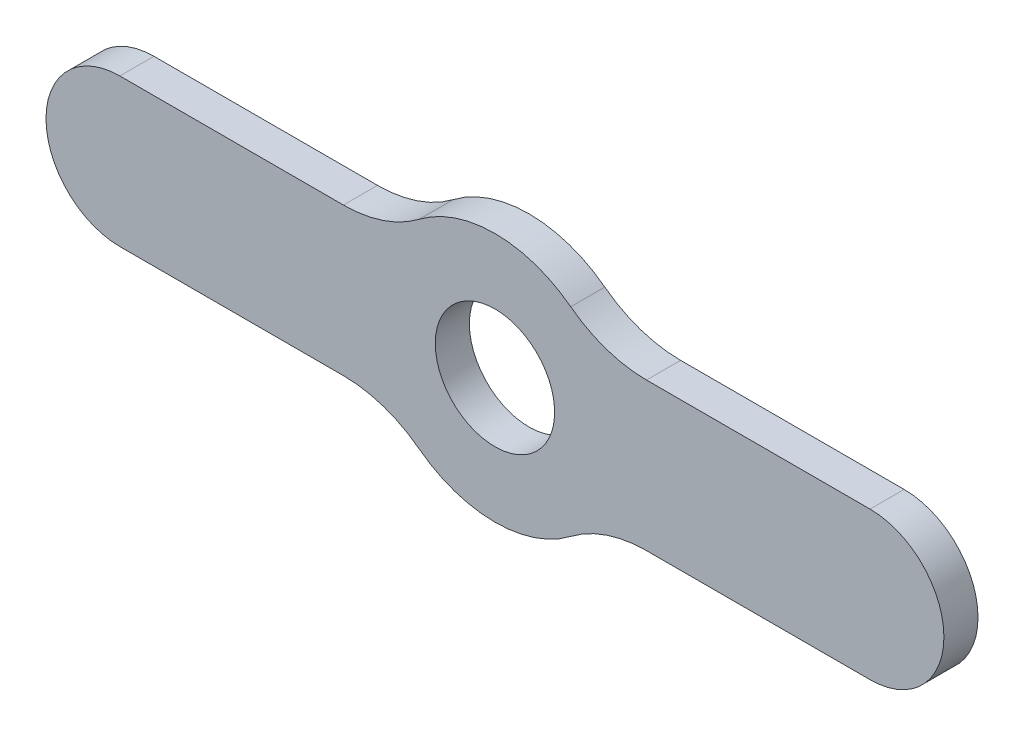
ISO-10303-21;
HEADER;
FILE_DESCRIPTION(('STEP AP214'),'2;1');
FILE_NAME('part.step','',(''),(''),'','','');
FILE_SCHEMA(('AUTOMOTIVE_DESIGN { 1 0 10303 214 1 1 1 1 }'));
ENDSEC;
DATA;
#1=APPLICATION_CONTEXT('core data for automotive mechanical design processes');
#2=APPLICATION_PROTOCOL_DEFINITION('international standard','automotive_design',2000,#1);
#3=PRODUCT_CONTEXT('',#1,'mechanical');
#4=PRODUCT('Part','Part','',(#3));
#5=PRODUCT_RELATED_PRODUCT_CATEGORY('part','',(#4));
#6=PRODUCT_DEFINITION_FORMATION('','',#4);
#7=PRODUCT_DEFINITION_CONTEXT('part definition',#1,'design');
#8=PRODUCT_DEFINITION('design','',#6,#7);
#9=PRODUCT_DEFINITION_SHAPE('','',#8);
#10=(LENGTH_UNIT() NAMED_UNIT(*) SI_UNIT(.MILLI.,.METRE.));
#11=(NAMED_UNIT(*) PLANE_ANGLE_UNIT() SI_UNIT($,.RADIAN.));
#12=(NAMED_UNIT(*) SI_UNIT($,.STERADIAN.) SOLID_ANGLE_UNIT());
#13=UNCERTAINTY_MEASURE_WITH_UNIT(LENGTH_MEASURE(1.E-05),#10,'distance_accuracy_value','');
#14=(GEOMETRIC_REPRESENTATION_CONTEXT(3) GLOBAL_UNCERTAINTY_ASSIGNED_CONTEXT((#13)) GLOBAL_UNIT_ASSIGNED_CONTEXT((#10,
#11,#12)) REPRESENTATION_CONTEXT('',''));
#15=CARTESIAN_POINT('',(0.,0.,0.));
#16=DIRECTION('',(0.,0.,1.));
#17=DIRECTION('',(1.,0.,0.));
#18=AXIS2_PLACEMENT_3D('',#15,#16,#17);
#19=CARTESIAN_POINT('',(33.,0.,-3.));
#20=DIRECTION('',(0.,0.,1.));
#21=DIRECTION('',(1.,0.,0.));
#22=AXIS2_PLACEMENT_3D('',#19,#20,#21);
#23=CYLINDRICAL_SURFACE('',#22,6.5);
#24=CARTESIAN_POINT('',(33.,0.,0.));
#25=DIRECTION('',(0.,0.,1.));
#26=DIRECTION('',(-1.,0.,0.));
#27=AXIS2_PLACEMENT_3D('',#24,#25,#26);
#28=CIRCLE('',#27,6.5);
#29=CARTESIAN_POINT('',(33.,-6.49999999999999,0.));
#30=VERTEX_POINT('',#29);
#31=CARTESIAN_POINT('',(33.,6.50000000000001,0.));
#32=VERTEX_POINT('',#31);
#33=EDGE_CURVE('E177',#30,#32,#28,.T.);
#34=ORIENTED_EDGE('',*,*,#33,.F.);
#35=DIRECTION('',(0.,0.,1.));
#36=VECTOR('',#35,1.);
#37=CARTESIAN_POINT('',(33.,-6.49999999999999,-3.));
#38=LINE('',#37,#36);
#39=CARTESIAN_POINT('',(33.,-6.49999999999999,-3.));
#40=VERTEX_POINT('',#39);
#41=EDGE_CURVE('E154',#40,#30,#38,.T.);
#42=ORIENTED_EDGE('',*,*,#41,.F.);
#43=CARTESIAN_POINT('',(33.,0.,-3.));
#44=DIRECTION('',(0.,0.,1.));
#45=DIRECTION('',(-1.,0.,0.));
#46=AXIS2_PLACEMENT_3D('',#43,#44,#45);
#47=CIRCLE('',#46,6.5);
#48=CARTESIAN_POINT('',(33.,6.50000000000001,-3.));
#49=VERTEX_POINT('',#48);
#50=EDGE_CURVE('E150',#40,#49,#47,.T.);
#51=ORIENTED_EDGE('',*,*,#50,.T.);
#52=DIRECTION('',(0.,0.,1.));
#53=VECTOR('',#52,1.);
#54=CARTESIAN_POINT('',(33.,6.50000000000001,-3.));
#55=LINE('',#54,#53);
#56=EDGE_CURVE('E129',#49,#32,#55,.T.);
#57=ORIENTED_EDGE('',*,*,#56,.T.);
#58=EDGE_LOOP('',(#34,#42,#51,#57));
#59=FACE_BOUND('',#58,.T.);
#60=ADVANCED_FACE('F45',(#59),#23,.T.);
#61=CARTESIAN_POINT('',(8.87411967464943,-6.49999999999999,-3.));
#62=DIRECTION('',(0.,-1.,0.));
#63=DIRECTION('',(1.,0.,0.));
#64=AXIS2_PLACEMENT_3D('',#61,#62,#63);
#65=PLANE('',#64);
#66=DIRECTION('',(1.,0.,0.));
#67=VECTOR('',#66,1.);
#68=CARTESIAN_POINT('',(8.87411967464943,-6.49999999999999,0.));
#69=LINE('',#68,#67);
#70=CARTESIAN_POINT('',(13.3322916259734,-6.49999999999999,0.));
#71=VERTEX_POINT('',#70);
#72=EDGE_CURVE('E156',#71,#30,#69,.T.);
#73=ORIENTED_EDGE('',*,*,#72,.F.);
#74=DIRECTION('',(0.,0.,-1.));
#75=VECTOR('',#74,1.);
#76=CARTESIAN_POINT('',(13.3322916259734,-6.49999999999999,-3.));
#77=LINE('',#76,#75);
#78=CARTESIAN_POINT('',(13.3322916259734,-6.49999999999999,-3.));
#79=VERTEX_POINT('',#78);
#80=EDGE_CURVE('E60',#71,#79,#77,.T.);
#81=ORIENTED_EDGE('',*,*,#80,.T.);
#82=DIRECTION('',(1.,0.,0.));
#83=VECTOR('',#82,1.);
#84=CARTESIAN_POINT('',(8.87411967464943,-6.49999999999999,-3.));
#85=LINE('',#84,#83);
#86=EDGE_CURVE('E142',#79,#40,#85,.T.);
#87=ORIENTED_EDGE('',*,*,#86,.T.);
#88=ORIENTED_EDGE('',*,*,#41,.T.);
#89=EDGE_LOOP('',(#73,#81,#87,#88));
#90=FACE_BOUND('',#89,.T.);
#91=ADVANCED_FACE('F242',(#90),#65,.T.);
#92=CARTESIAN_POINT('',(0.,0.,-3.));
#93=DIRECTION('',(0.,0.,1.));
#94=DIRECTION('',(1.,0.,0.));
#95=AXIS2_PLACEMENT_3D('',#92,#93,#94);
#96=CYLINDRICAL_SURFACE('',#95,11.);
#97=CARTESIAN_POINT('',(0.,0.,0.));
#98=DIRECTION('',(0.,0.,1.));
#99=DIRECTION('',(1.,0.,0.));
#100=AXIS2_PLACEMENT_3D('',#97,#98,#99);
#101=CIRCLE('',#100,11.);
#102=CARTESIAN_POINT('',(-6.66614581298669,-8.75,0.));
#103=VERTEX_POINT('',#102);
#104=CARTESIAN_POINT('',(6.6661458129867,-8.74999999999999,0.));
#105=VERTEX_POINT('',#104);
#106=EDGE_CURVE('E158',#103,#105,#101,.T.);
#107=ORIENTED_EDGE('',*,*,#106,.F.);
#108=DIRECTION('',(0.,0.,1.));
#109=VECTOR('',#108,1.);
#110=CARTESIAN_POINT('',(-6.66614581298669,-8.75,-3.));
#111=LINE('',#110,#109);
#112=CARTESIAN_POINT('',(-6.66614581298669,-8.75,-3.));
#113=VERTEX_POINT('',#112);
#114=EDGE_CURVE('E216',#103,#113,#111,.F.);
#115=ORIENTED_EDGE('',*,*,#114,.T.);
#116=CARTESIAN_POINT('',(0.,0.,-3.));
#117=DIRECTION('',(0.,0.,1.));
#118=DIRECTION('',(-1.,0.,0.));
#119=AXIS2_PLACEMENT_3D('',#116,#117,#118);
#120=CIRCLE('',#119,11.);
#121=CARTESIAN_POINT('',(6.6661458129867,-8.74999999999999,-3.));
#122=VERTEX_POINT('',#121);
#123=EDGE_CURVE('E172',#113,#122,#120,.T.);
#124=ORIENTED_EDGE('',*,*,#123,.T.);
#125=DIRECTION('',(0.,0.,1.));
#126=VECTOR('',#125,1.);
#127=CARTESIAN_POINT('',(6.6661458129867,-8.74999999999999,-3.));
#128=LINE('',#127,#126);
#129=EDGE_CURVE('E213',#122,#105,#128,.T.);
#130=ORIENTED_EDGE('',*,*,#129,.T.);
#131=EDGE_LOOP('',(#107,#115,#124,#130));
#132=FACE_BOUND('',#131,.T.);
#133=ADVANCED_FACE('F239',(#132),#96,.T.);
#134=CARTESIAN_POINT('',(-33.,-6.5,-3.));
#135=DIRECTION('',(0.,-1.,0.));
#136=DIRECTION('',(1.,0.,0.));
#137=AXIS2_PLACEMENT_3D('',#134,#135,#136);
#138=PLANE('',#137);
#139=DIRECTION('',(1.,0.,0.));
#140=VECTOR('',#139,1.);
#141=CARTESIAN_POINT('',(-33.,-6.5,-3.));
#142=LINE('',#141,#140);
#143=CARTESIAN_POINT('',(-33.,-6.5,-3.));
#144=VERTEX_POINT('',#143);
#145=CARTESIAN_POINT('',(-13.3322916259734,-6.5,-3.));
#146=VERTEX_POINT('',#145);
#147=EDGE_CURVE('E168',#144,#146,#142,.T.);
#148=ORIENTED_EDGE('',*,*,#147,.T.);
#149=DIRECTION('',(0.,0.,-1.));
#150=VECTOR('',#149,1.);
#151=CARTESIAN_POINT('',(-13.3322916259734,-6.5,0.));
#152=LINE('',#151,#150);
#153=CARTESIAN_POINT('',(-13.3322916259734,-6.5,0.));
#154=VERTEX_POINT('',#153);
#155=EDGE_CURVE('E209',#146,#154,#152,.F.);
#156=ORIENTED_EDGE('',*,*,#155,.T.);
#157=DIRECTION('',(1.,0.,0.));
#158=VECTOR('',#157,1.);
#159=CARTESIAN_POINT('',(-33.,-6.5,0.));
#160=LINE('',#159,#158);
#161=CARTESIAN_POINT('',(-33.,-6.5,0.));
#162=VERTEX_POINT('',#161);
#163=EDGE_CURVE('E190',#162,#154,#160,.T.);
#164=ORIENTED_EDGE('',*,*,#163,.F.);
#165=DIRECTION('',(0.,0.,1.));
#166=VECTOR('',#165,1.);
#167=CARTESIAN_POINT('',(-33.,-6.5,-3.));
#168=LINE('',#167,#166);
#169=EDGE_CURVE('E192',#144,#162,#168,.T.);
#170=ORIENTED_EDGE('',*,*,#169,.F.);
#171=EDGE_LOOP('',(#148,#156,#164,#170));
#172=FACE_BOUND('',#171,.T.);
#173=ADVANCED_FACE('F234',(#172),#138,.T.);
#174=CARTESIAN_POINT('',(-33.,0.,-3.));
#175=DIRECTION('',(0.,0.,1.));
#176=DIRECTION('',(1.,0.,0.));
#177=AXIS2_PLACEMENT_3D('',#174,#175,#176);
#178=CYLINDRICAL_SURFACE('',#177,6.5);
#179=CARTESIAN_POINT('',(-33.,0.,0.));
#180=DIRECTION('',(0.,0.,1.));
#181=DIRECTION('',(1.,0.,0.));
#182=AXIS2_PLACEMENT_3D('',#179,#180,#181);
#183=CIRCLE('',#182,6.5);
#184=CARTESIAN_POINT('',(-33.,6.5,0.));
#185=VERTEX_POINT('',#184);
#186=EDGE_CURVE('E184',#185,#162,#183,.T.);
#187=ORIENTED_EDGE('',*,*,#186,.F.);
#188=DIRECTION('',(0.,0.,1.));
#189=VECTOR('',#188,1.);
#190=CARTESIAN_POINT('',(-33.,6.5,-3.));
#191=LINE('',#190,#189);
#192=CARTESIAN_POINT('',(-33.,6.5,-3.));
#193=VERTEX_POINT('',#192);
#194=EDGE_CURVE('E143',#193,#185,#191,.T.);
#195=ORIENTED_EDGE('',*,*,#194,.F.);
#196=CARTESIAN_POINT('',(-33.,0.,-3.));
#197=DIRECTION('',(0.,0.,1.));
#198=DIRECTION('',(1.,0.,0.));
#199=AXIS2_PLACEMENT_3D('',#196,#197,#198);
#200=CIRCLE('',#199,6.5);
#201=EDGE_CURVE('E170',#193,#144,#200,.T.);
#202=ORIENTED_EDGE('',*,*,#201,.T.);
#203=ORIENTED_EDGE('',*,*,#169,.T.);
#204=EDGE_LOOP('',(#187,#195,#202,#203));
#205=FACE_BOUND('',#204,.T.);
#206=ADVANCED_FACE('F277',(#205),#178,.T.);
#207=CARTESIAN_POINT('',(-33.,6.5,-3.));
#208=DIRECTION('',(0.,1.,0.));
#209=DIRECTION('',(-1.,0.,0.));
#210=AXIS2_PLACEMENT_3D('',#207,#208,#209);
#211=PLANE('',#210);
#212=DIRECTION('',(-1.,0.,0.));
#213=VECTOR('',#212,1.);
#214=CARTESIAN_POINT('',(-33.,6.5,0.));
#215=LINE('',#214,#213);
#216=CARTESIAN_POINT('',(-13.3322916259734,6.5,0.));
#217=VERTEX_POINT('',#216);
#218=EDGE_CURVE('E185',#217,#185,#215,.T.);
#219=ORIENTED_EDGE('',*,*,#218,.F.);
#220=DIRECTION('',(0.,0.,-1.));
#221=VECTOR('',#220,1.);
#222=CARTESIAN_POINT('',(-13.3322916259734,6.5,-3.));
#223=LINE('',#222,#221);
#224=CARTESIAN_POINT('',(-13.3322916259734,6.5,-3.));
#225=VERTEX_POINT('',#224);
#226=EDGE_CURVE('E200',#217,#225,#223,.T.);
#227=ORIENTED_EDGE('',*,*,#226,.T.);
#228=DIRECTION('',(-1.,0.,0.));
#229=VECTOR('',#228,1.);
#230=CARTESIAN_POINT('',(-33.,6.5,-3.));
#231=LINE('',#230,#229);
#232=EDGE_CURVE('E164',#225,#193,#231,.T.);
#233=ORIENTED_EDGE('',*,*,#232,.T.);
#234=ORIENTED_EDGE('',*,*,#194,.T.);
#235=EDGE_LOOP('',(#219,#227,#233,#234));
#236=FACE_BOUND('',#235,.T.);
#237=ADVANCED_FACE('F272',(#236),#211,.T.);
#238=CARTESIAN_POINT('',(0.,0.,-3.));
#239=DIRECTION('',(0.,0.,1.));
#240=DIRECTION('',(1.,0.,0.));
#241=AXIS2_PLACEMENT_3D('',#238,#239,#240);
#242=CYLINDRICAL_SURFACE('',#241,11.);
#243=CARTESIAN_POINT('',(0.,0.,0.));
#244=DIRECTION('',(0.,0.,1.));
#245=DIRECTION('',(1.,0.,0.));
#246=AXIS2_PLACEMENT_3D('',#243,#244,#245);
#247=CIRCLE('',#246,11.);
#248=CARTESIAN_POINT('',(6.66614581298668,8.75000000000001,0.));
#249=VERTEX_POINT('',#248);
#250=CARTESIAN_POINT('',(-6.66614581298669,8.75,0.));
#251=VERTEX_POINT('',#250);
#252=EDGE_CURVE('E180',#249,#251,#247,.T.);
#253=ORIENTED_EDGE('',*,*,#252,.F.);
#254=DIRECTION('',(0.,0.,1.));
#255=VECTOR('',#254,1.);
#256=CARTESIAN_POINT('',(6.66614581298668,8.75000000000001,-3.));
#257=LINE('',#256,#255);
#258=CARTESIAN_POINT('',(6.66614581298668,8.75000000000001,-3.));
#259=VERTEX_POINT('',#258);
#260=EDGE_CURVE('E208',#249,#259,#257,.F.);
#261=ORIENTED_EDGE('',*,*,#260,.T.);
#262=CARTESIAN_POINT('',(0.,0.,-3.));
#263=DIRECTION('',(0.,0.,1.));
#264=DIRECTION('',(-1.,0.,0.));
#265=AXIS2_PLACEMENT_3D('',#262,#263,#264);
#266=CIRCLE('',#265,11.);
#267=CARTESIAN_POINT('',(-6.66614581298669,8.75,-3.));
#268=VERTEX_POINT('',#267);
#269=EDGE_CURVE('E151',#259,#268,#266,.T.);
#270=ORIENTED_EDGE('',*,*,#269,.T.);
#271=DIRECTION('',(0.,0.,1.));
#272=VECTOR('',#271,1.);
#273=CARTESIAN_POINT('',(-6.66614581298669,8.75,-3.));
#274=LINE('',#273,#272);
#275=EDGE_CURVE('E195',#268,#251,#274,.T.);
#276=ORIENTED_EDGE('',*,*,#275,.T.);
#277=EDGE_LOOP('',(#253,#261,#270,#276));
#278=FACE_BOUND('',#277,.T.);
#279=ADVANCED_FACE('F248',(#278),#242,.T.);
#280=CARTESIAN_POINT('',(8.87411967464942,6.50000000000001,-3.));
#281=DIRECTION('',(0.,1.,0.));
#282=DIRECTION('',(-1.,0.,0.));
#283=AXIS2_PLACEMENT_3D('',#280,#281,#282);
#284=PLANE('',#283);
#285=DIRECTION('',(-1.,0.,0.));
#286=VECTOR('',#285,1.);
#287=CARTESIAN_POINT('',(8.87411967464942,6.50000000000001,-3.));
#288=LINE('',#287,#286);
#289=CARTESIAN_POINT('',(13.3322916259734,6.50000000000001,-3.));
#290=VERTEX_POINT('',#289);
#291=EDGE_CURVE('E132',#49,#290,#288,.T.);
#292=ORIENTED_EDGE('',*,*,#291,.T.);
#293=DIRECTION('',(0.,0.,-1.));
#294=VECTOR('',#293,1.);
#295=CARTESIAN_POINT('',(13.3322916259734,6.50000000000001,0.));
#296=LINE('',#295,#294);
#297=CARTESIAN_POINT('',(13.3322916259734,6.50000000000001,0.));
#298=VERTEX_POINT('',#297);
#299=EDGE_CURVE('E206',#290,#298,#296,.F.);
#300=ORIENTED_EDGE('',*,*,#299,.T.);
#301=DIRECTION('',(-1.,0.,0.));
#302=VECTOR('',#301,1.);
#303=CARTESIAN_POINT('',(8.87411967464942,6.50000000000001,0.));
#304=LINE('',#303,#302);
#305=EDGE_CURVE('E136',#32,#298,#304,.T.);
#306=ORIENTED_EDGE('',*,*,#305,.F.);
#307=ORIENTED_EDGE('',*,*,#56,.F.);
#308=EDGE_LOOP('',(#292,#300,#306,#307));
#309=FACE_BOUND('',#308,.T.);
#310=ADVANCED_FACE('F131',(#309),#284,.T.);
#311=CARTESIAN_POINT('',(33.,0.,-3.));
#312=DIRECTION('',(0.,0.,-1.));
#313=DIRECTION('',(-1.,0.,0.));
#314=AXIS2_PLACEMENT_3D('',#311,#312,#313);
#315=PLANE('',#314);
#316=CARTESIAN_POINT('',(0.,0.,-3.));
#317=DIRECTION('',(0.,0.,-1.));
#318=DIRECTION('',(-1.,0.,0.));
#319=AXIS2_PLACEMENT_3D('',#316,#317,#318);
#320=CIRCLE('',#319,5.25);
#321=CARTESIAN_POINT('',(-5.25,0.,-3.));
#322=VERTEX_POINT('',#321);
#323=EDGE_CURVE('E298',#322,#322,#320,.T.);
#324=ORIENTED_EDGE('',*,*,#323,.F.);
#325=EDGE_LOOP('',(#324));
#326=FACE_BOUND('',#325,.T.);
#327=ORIENTED_EDGE('',*,*,#50,.F.);
#328=ORIENTED_EDGE('',*,*,#86,.F.);
#329=CARTESIAN_POINT('',(13.3322916259734,-17.5,-3.));
#330=DIRECTION('',(0.,0.,-1.));
#331=DIRECTION('',(-1.,0.,0.));
#332=AXIS2_PLACEMENT_3D('',#329,#330,#331);
#333=CIRCLE('',#332,11.);
#334=EDGE_CURVE('E11',#79,#122,#333,.F.);
#335=ORIENTED_EDGE('',*,*,#334,.T.);
#336=ORIENTED_EDGE('',*,*,#123,.F.);
#337=CARTESIAN_POINT('',(-13.3322916259734,-17.5,-3.));
#338=DIRECTION('',(0.,0.,-1.));
#339=DIRECTION('',(-1.,0.,0.));
#340=AXIS2_PLACEMENT_3D('',#337,#338,#339);
#341=CIRCLE('',#340,11.);
#342=EDGE_CURVE('E221',#113,#146,#341,.F.);
#343=ORIENTED_EDGE('',*,*,#342,.T.);
#344=ORIENTED_EDGE('',*,*,#147,.F.);
#345=ORIENTED_EDGE('',*,*,#201,.F.);
#346=ORIENTED_EDGE('',*,*,#232,.F.);
#347=CARTESIAN_POINT('',(-13.3322916259734,17.5,-3.));
#348=DIRECTION('',(0.,0.,-1.));
#349=DIRECTION('',(-1.,0.,0.));
#350=AXIS2_PLACEMENT_3D('',#347,#348,#349);
#351=CIRCLE('',#350,11.);
#352=EDGE_CURVE('E201',#225,#268,#351,.F.);
#353=ORIENTED_EDGE('',*,*,#352,.T.);
#354=ORIENTED_EDGE('',*,*,#269,.F.);
#355=CARTESIAN_POINT('',(13.3322916259734,17.5,-3.));
#356=DIRECTION('',(0.,0.,-1.));
#357=DIRECTION('',(-1.,0.,0.));
#358=AXIS2_PLACEMENT_3D('',#355,#356,#357);
#359=CIRCLE('',#358,11.);
#360=EDGE_CURVE('E147',#259,#290,#359,.F.);
#361=ORIENTED_EDGE('',*,*,#360,.T.);
#362=ORIENTED_EDGE('',*,*,#291,.F.);
#363=EDGE_LOOP('',(#327,#328,#335,#336,#343,#344,#345,#346,#353,#354,#361,#362));
#364=FACE_BOUND('',#363,.T.);
#365=ADVANCED_FACE('F148',(#326,#364),#315,.T.);
#366=CARTESIAN_POINT('',(33.,0.,0.));
#367=DIRECTION('',(0.,0.,-1.));
#368=DIRECTION('',(-1.,0.,0.));
#369=AXIS2_PLACEMENT_3D('',#366,#367,#368);
#370=PLANE('',#369);
#371=CARTESIAN_POINT('',(0.,0.,0.));
#372=DIRECTION('',(0.,0.,-1.));
#373=DIRECTION('',(-1.,0.,0.));
#374=AXIS2_PLACEMENT_3D('',#371,#372,#373);
#375=CIRCLE('',#374,5.25);
#376=CARTESIAN_POINT('',(-5.25,0.,0.));
#377=VERTEX_POINT('',#376);
#378=EDGE_CURVE('E161',#377,#377,#375,.F.);
#379=ORIENTED_EDGE('',*,*,#378,.F.);
#380=EDGE_LOOP('',(#379));
#381=FACE_BOUND('',#380,.T.);
#382=ORIENTED_EDGE('',*,*,#33,.T.);
#383=ORIENTED_EDGE('',*,*,#305,.T.);
#384=CARTESIAN_POINT('',(13.3322916259734,17.5,0.));
#385=DIRECTION('',(0.,0.,-1.));
#386=DIRECTION('',(-1.,0.,0.));
#387=AXIS2_PLACEMENT_3D('',#384,#385,#386);
#388=CIRCLE('',#387,11.);
#389=EDGE_CURVE('E218',#298,#249,#388,.T.);
#390=ORIENTED_EDGE('',*,*,#389,.T.);
#391=ORIENTED_EDGE('',*,*,#252,.T.);
#392=CARTESIAN_POINT('',(-13.3322916259734,17.5,0.));
#393=DIRECTION('',(0.,0.,-1.));
#394=DIRECTION('',(-1.,0.,0.));
#395=AXIS2_PLACEMENT_3D('',#392,#393,#394);
#396=CIRCLE('',#395,11.);
#397=EDGE_CURVE('E203',#251,#217,#396,.T.);
#398=ORIENTED_EDGE('',*,*,#397,.T.);
#399=ORIENTED_EDGE('',*,*,#218,.T.);
#400=ORIENTED_EDGE('',*,*,#186,.T.);
#401=ORIENTED_EDGE('',*,*,#163,.T.);
#402=CARTESIAN_POINT('',(-13.3322916259734,-17.5,0.));
#403=DIRECTION('',(0.,0.,-1.));
#404=DIRECTION('',(-1.,0.,0.));
#405=AXIS2_PLACEMENT_3D('',#402,#403,#404);
#406=CIRCLE('',#405,11.);
#407=EDGE_CURVE('E225',#154,#103,#406,.T.);
#408=ORIENTED_EDGE('',*,*,#407,.T.);
#409=ORIENTED_EDGE('',*,*,#106,.T.);
#410=CARTESIAN_POINT('',(13.3322916259734,-17.5,0.));
#411=DIRECTION('',(0.,0.,-1.));
#412=DIRECTION('',(-1.,0.,0.));
#413=AXIS2_PLACEMENT_3D('',#410,#411,#412);
#414=CIRCLE('',#413,11.);
#415=EDGE_CURVE('E49',#105,#71,#414,.T.);
#416=ORIENTED_EDGE('',*,*,#415,.T.);
#417=ORIENTED_EDGE('',*,*,#72,.T.);
#418=EDGE_LOOP('',(#382,#383,#390,#391,#398,#399,#400,#401,#408,#409,#416,#417));
#419=FACE_BOUND('',#418,.T.);
#420=ADVANCED_FACE('F240',(#381,#419),#370,.F.);
#421=CARTESIAN_POINT('',(-13.3322916259734,17.5,-3.));
#422=DIRECTION('',(0.,0.,1.));
#423=DIRECTION('',(1.,0.,0.));
#424=AXIS2_PLACEMENT_3D('',#421,#422,#423);
#425=CYLINDRICAL_SURFACE('',#424,11.);
#426=ORIENTED_EDGE('',*,*,#352,.F.);
#427=ORIENTED_EDGE('',*,*,#226,.F.);
#428=ORIENTED_EDGE('',*,*,#397,.F.);
#429=ORIENTED_EDGE('',*,*,#275,.F.);
#430=EDGE_LOOP('',(#426,#427,#428,#429));
#431=FACE_BOUND('',#430,.T.);
#432=ADVANCED_FACE('F251',(#431),#425,.F.);
#433=CARTESIAN_POINT('',(13.3322916259734,17.5,-3.));
#434=DIRECTION('',(0.,0.,1.));
#435=DIRECTION('',(1.,0.,0.));
#436=AXIS2_PLACEMENT_3D('',#433,#434,#435);
#437=CYLINDRICAL_SURFACE('',#436,11.);
#438=ORIENTED_EDGE('',*,*,#360,.F.);
#439=ORIENTED_EDGE('',*,*,#260,.F.);
#440=ORIENTED_EDGE('',*,*,#389,.F.);
#441=ORIENTED_EDGE('',*,*,#299,.F.);
#442=EDGE_LOOP('',(#438,#439,#440,#441));
#443=FACE_BOUND('',#442,.T.);
#444=ADVANCED_FACE('F253',(#443),#437,.F.);
#445=CARTESIAN_POINT('',(-13.3322916259734,-17.5,-3.));
#446=DIRECTION('',(0.,0.,1.));
#447=DIRECTION('',(1.,0.,0.));
#448=AXIS2_PLACEMENT_3D('',#445,#446,#447);
#449=CYLINDRICAL_SURFACE('',#448,11.);
#450=ORIENTED_EDGE('',*,*,#342,.F.);
#451=ORIENTED_EDGE('',*,*,#114,.F.);
#452=ORIENTED_EDGE('',*,*,#407,.F.);
#453=ORIENTED_EDGE('',*,*,#155,.F.);
#454=EDGE_LOOP('',(#450,#451,#452,#453));
#455=FACE_BOUND('',#454,.T.);
#456=ADVANCED_FACE('F235',(#455),#449,.F.);
#457=CARTESIAN_POINT('',(13.3322916259734,-17.5,-3.));
#458=DIRECTION('',(0.,0.,1.));
#459=DIRECTION('',(1.,0.,0.));
#460=AXIS2_PLACEMENT_3D('',#457,#458,#459);
#461=CYLINDRICAL_SURFACE('',#460,11.);
#462=ORIENTED_EDGE('',*,*,#334,.F.);
#463=ORIENTED_EDGE('',*,*,#80,.F.);
#464=ORIENTED_EDGE('',*,*,#415,.F.);
#465=ORIENTED_EDGE('',*,*,#129,.F.);
#466=EDGE_LOOP('',(#462,#463,#464,#465));
#467=FACE_BOUND('',#466,.T.);
#468=ADVANCED_FACE('F42',(#467),#461,.F.);
#469=CARTESIAN_POINT('',(0.,0.,0.00100000000000013));
#470=DIRECTION('',(0.,0.,-1.));
#471=DIRECTION('',(-1.,0.,0.));
#472=AXIS2_PLACEMENT_3D('',#469,#470,#471);
#473=CYLINDRICAL_SURFACE('',#472,5.25);
#474=CARTESIAN_POINT('',(-5.25,0.,-3.));
#475=CARTESIAN_POINT('',(-5.25,0.,-2.96875));
#476=CARTESIAN_POINT('',(-5.25,0.,-2.9375));
#477=CARTESIAN_POINT('',(-5.25,0.,-2.875));
#478=CARTESIAN_POINT('',(-5.25,0.,-2.84375));
#479=CARTESIAN_POINT('',(-5.25,0.,-2.78125));
#480=CARTESIAN_POINT('',(-5.25,0.,-2.75));
#481=CARTESIAN_POINT('',(-5.25,0.,-2.6875));
#482=CARTESIAN_POINT('',(-5.25,0.,-2.65625));
#483=CARTESIAN_POINT('',(-5.25,0.,-2.59375));
#484=CARTESIAN_POINT('',(-5.25,0.,-2.5625));
#485=CARTESIAN_POINT('',(-5.25,0.,-2.5));
#486=CARTESIAN_POINT('',(-5.25,0.,-2.46875));
#487=CARTESIAN_POINT('',(-5.25,0.,-2.40625));
#488=CARTESIAN_POINT('',(-5.25,0.,-2.375));
#489=CARTESIAN_POINT('',(-5.25,0.,-2.3125));
#490=CARTESIAN_POINT('',(-5.25,0.,-2.28125));
#491=CARTESIAN_POINT('',(-5.25,0.,-2.21875));
#492=CARTESIAN_POINT('',(-5.25,0.,-2.1875));
#493=CARTESIAN_POINT('',(-5.25,0.,-2.125));
#494=CARTESIAN_POINT('',(-5.25,0.,-2.09375));
#495=CARTESIAN_POINT('',(-5.25,0.,-2.03125));
#496=CARTESIAN_POINT('',(-5.25,0.,-2.));
#497=CARTESIAN_POINT('',(-5.25,0.,-1.9375));
#498=CARTESIAN_POINT('',(-5.25,0.,-1.90625));
#499=CARTESIAN_POINT('',(-5.25,0.,-1.84375));
#500=CARTESIAN_POINT('',(-5.25,0.,-1.8125));
#501=CARTESIAN_POINT('',(-5.25,0.,-1.75));
#502=CARTESIAN_POINT('',(-5.25,0.,-1.71875));
#503=CARTESIAN_POINT('',(-5.25,0.,-1.65625));
#504=CARTESIAN_POINT('',(-5.25,0.,-1.625));
#505=CARTESIAN_POINT('',(-5.25,0.,-1.5625));
#506=CARTESIAN_POINT('',(-5.25,0.,-1.53125));
#507=CARTESIAN_POINT('',(-5.25,0.,-1.46875));
#508=CARTESIAN_POINT('',(-5.25,0.,-1.4375));
#509=CARTESIAN_POINT('',(-5.25,0.,-1.375));
#510=CARTESIAN_POINT('',(-5.25,0.,-1.34375));
#511=CARTESIAN_POINT('',(-5.25,0.,-1.28125));
#512=CARTESIAN_POINT('',(-5.25,0.,-1.25));
#513=CARTESIAN_POINT('',(-5.25,0.,-1.1875));
#514=CARTESIAN_POINT('',(-5.25,0.,-1.15625));
#515=CARTESIAN_POINT('',(-5.25,0.,-1.09375));
#516=CARTESIAN_POINT('',(-5.25,0.,-1.0625));
#517=CARTESIAN_POINT('',(-5.25,0.,-1.));
#518=CARTESIAN_POINT('',(-5.25,0.,-0.96875));
#519=CARTESIAN_POINT('',(-5.25,0.,-0.90625));
#520=CARTESIAN_POINT('',(-5.25,0.,-0.875));
#521=CARTESIAN_POINT('',(-5.25,0.,-0.8125));
#522=CARTESIAN_POINT('',(-5.25,0.,-0.78125));
#523=CARTESIAN_POINT('',(-5.25,0.,-0.71875));
#524=CARTESIAN_POINT('',(-5.25,0.,-0.6875));
#525=CARTESIAN_POINT('',(-5.25,0.,-0.625));
#526=CARTESIAN_POINT('',(-5.25,0.,-0.59375));
#527=CARTESIAN_POINT('',(-5.25,0.,-0.53125));
#528=CARTESIAN_POINT('',(-5.25,0.,-0.5));
#529=CARTESIAN_POINT('',(-5.25,0.,-0.4375));
#530=CARTESIAN_POINT('',(-5.25,0.,-0.40625));
#531=CARTESIAN_POINT('',(-5.25,0.,-0.34375));
#532=CARTESIAN_POINT('',(-5.25,0.,-0.3125));
#533=CARTESIAN_POINT('',(-5.25,0.,-0.25));
#534=CARTESIAN_POINT('',(-5.25,0.,-0.21875));
#535=CARTESIAN_POINT('',(-5.25,0.,-0.15625));
#536=CARTESIAN_POINT('',(-5.25,0.,-0.125));
#537=CARTESIAN_POINT('',(-5.25,0.,-0.0625000000000001));
#538=CARTESIAN_POINT('',(-5.25,0.,-0.0312500000000001));
#539=CARTESIAN_POINT('',(-5.25,0.,0.));
#540=B_SPLINE_CURVE_WITH_KNOTS('',3,(#474,#475,#476,#477,#478,#479,#480,#481,#482,#483,#484,
#485,#486,#487,#488,#489,#490,#491,#492,#493,#494,#495,#496,#497,#498,#499,#500,#501,#502,#503,
#504,#505,#506,#507,#508,#509,#510,#511,#512,#513,#514,#515,#516,#517,#518,#519,#520,#521,#522,
#523,#524,#525,#526,#527,#528,#529,#530,#531,#532,#533,#534,#535,#536,#537,#538,#539),
.UNSPECIFIED.,.F.,.F.,(4,2,2,2,2,2,2,2,2,2,2,2,2,2,2,2,2,2,2,2,2,2,2,2,2,2,2,2,2,2,2,2,4),(0.,
0.0937500000000001,0.1875,0.28125,0.375,0.46875,0.5625,0.65625,0.75,0.84375,0.9375,1.03125,
1.125,1.21875,1.3125,1.40625,1.5,1.59375,1.6875,1.78125,1.875,1.96875,2.0625,2.15625,2.25,
2.34375,2.4375,2.53125,2.625,2.71875,2.8125,2.90625,3.),.UNSPECIFIED.);
#541=EDGE_CURVE('BSEAM290',#322,#377,#540,.T.);
#542=ORIENTED_EDGE('',*,*,#323,.T.);
#543=ORIENTED_EDGE('',*,*,#378,.T.);
#544=ORIENTED_EDGE('',*,*,#541,.T.);
#545=ORIENTED_EDGE('',*,*,#541,.F.);
#546=EDGE_LOOP('',(#542,#544,#543,#545));
#547=FACE_BOUND('',#546,.T.);
#548=ADVANCED_FACE('F290',(#547),#473,.F.);
#549=CLOSED_SHELL('',(#60,#91,#133,#173,#206,#237,#279,#310,#365,#420,#432,#444,#456,#468,#548));
#550=MANIFOLD_SOLID_BREP('B2',#549);
#551=ADVANCED_BREP_SHAPE_REPRESENTATION('',(#18,#550),#14);
#552=SHAPE_DEFINITION_REPRESENTATION(#9,#551);
ENDSEC;
END-ISO-10303-21;
